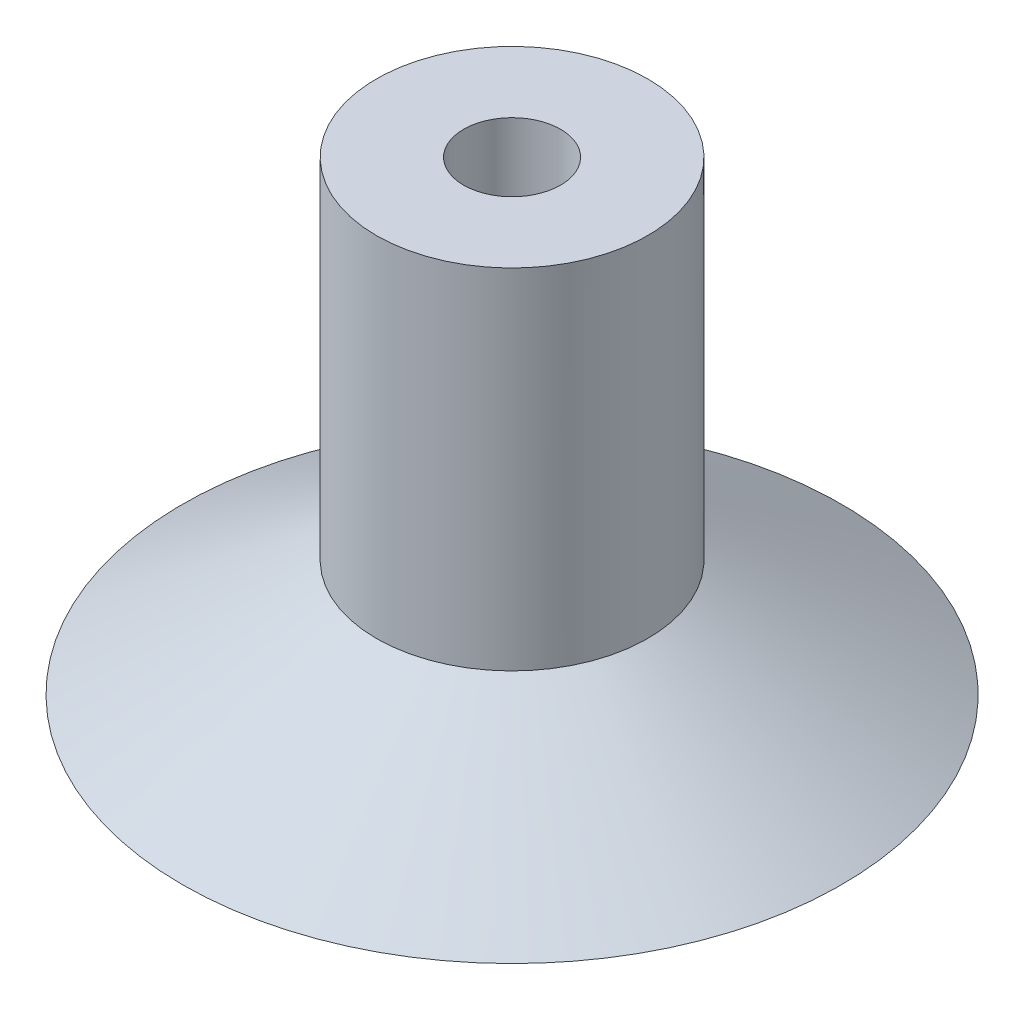
ISO-10303-21;
HEADER;
FILE_DESCRIPTION(('STEP AP214'),'2;1');
FILE_NAME('part.step','',(''),(''),'','','');
FILE_SCHEMA(('AUTOMOTIVE_DESIGN { 1 0 10303 214 1 1 1 1 }'));
ENDSEC;
DATA;
#1=APPLICATION_CONTEXT('core data for automotive mechanical design processes');
#2=APPLICATION_PROTOCOL_DEFINITION('international standard','automotive_design',2000,#1);
#3=PRODUCT_CONTEXT('',#1,'mechanical');
#4=PRODUCT('Part','Part','',(#3));
#5=PRODUCT_RELATED_PRODUCT_CATEGORY('part','',(#4));
#6=PRODUCT_DEFINITION_FORMATION('','',#4);
#7=PRODUCT_DEFINITION_CONTEXT('part definition',#1,'design');
#8=PRODUCT_DEFINITION('design','',#6,#7);
#9=PRODUCT_DEFINITION_SHAPE('','',#8);
#10=(LENGTH_UNIT() NAMED_UNIT(*) SI_UNIT(.MILLI.,.METRE.));
#11=(NAMED_UNIT(*) PLANE_ANGLE_UNIT() SI_UNIT($,.RADIAN.));
#12=(NAMED_UNIT(*) SI_UNIT($,.STERADIAN.) SOLID_ANGLE_UNIT());
#13=UNCERTAINTY_MEASURE_WITH_UNIT(LENGTH_MEASURE(1.E-05),#10,'distance_accuracy_value','');
#14=(GEOMETRIC_REPRESENTATION_CONTEXT(3) GLOBAL_UNCERTAINTY_ASSIGNED_CONTEXT((#13)) GLOBAL_UNIT_ASSIGNED_CONTEXT((#10,
#11,#12)) REPRESENTATION_CONTEXT('',''));
#15=CARTESIAN_POINT('',(0.,0.,0.));
#16=DIRECTION('',(0.,0.,1.));
#17=DIRECTION('',(1.,0.,0.));
#18=AXIS2_PLACEMENT_3D('',#15,#16,#17);
#19=CARTESIAN_POINT('',(-8.73225362560405,0.,8.5));
#20=DIRECTION('',(0.,-1.,0.));
#21=DIRECTION('',(0.,0.,-1.));
#22=AXIS2_PLACEMENT_3D('',#19,#20,#21);
#23=PLANE('',#22);
#24=CARTESIAN_POINT('',(0.,0.,0.));
#25=DIRECTION('',(0.,-1.,0.));
#26=DIRECTION('',(-1.16842128129653E-09,0.,1.));
#27=AXIS2_PLACEMENT_3D('',#24,#25,#26);
#28=CIRCLE('',#27,8.5);
#29=CARTESIAN_POINT('',(-9.93158089102053E-09,0.,8.5));
#30=VERTEX_POINT('',#29);
#31=EDGE_CURVE('E38',#30,#30,#28,.T.);
#32=ORIENTED_EDGE('',*,*,#31,.T.);
#33=EDGE_LOOP('',(#32));
#34=FACE_BOUND('',#33,.T.);
#35=CARTESIAN_POINT('',(0.,0.,0.));
#36=DIRECTION('',(0.,1.,0.));
#37=DIRECTION('',(0.,0.,-1.));
#38=AXIS2_PLACEMENT_3D('',#35,#36,#37);
#39=CIRCLE('',#38,8.);
#40=CARTESIAN_POINT('',(0.,0.,8.));
#41=VERTEX_POINT('',#40);
#42=EDGE_CURVE('E35',#41,#41,#39,.F.);
#43=ORIENTED_EDGE('',*,*,#42,.F.);
#44=EDGE_LOOP('',(#43));
#45=FACE_BOUND('',#44,.T.);
#46=ADVANCED_FACE('F15',(#34,#45),#23,.T.);
#47=CARTESIAN_POINT('',(-3.4999999999999,12.,-3.4999999999999));
#48=DIRECTION('',(0.,1.,0.));
#49=DIRECTION('',(0.,0.,1.));
#50=AXIS2_PLACEMENT_3D('',#47,#48,#49);
#51=PLANE('',#50);
#52=CARTESIAN_POINT('',(0.,12.,0.));
#53=DIRECTION('',(0.,1.,0.));
#54=DIRECTION('',(0.,0.,-1.));
#55=AXIS2_PLACEMENT_3D('',#52,#53,#54);
#56=CIRCLE('',#55,3.4999999999999);
#57=CARTESIAN_POINT('',(0.,12.,-3.4999999999999));
#58=VERTEX_POINT('',#57);
#59=EDGE_CURVE('E30',#58,#58,#56,.F.);
#60=ORIENTED_EDGE('',*,*,#59,.F.);
#61=EDGE_LOOP('',(#60));
#62=FACE_BOUND('',#61,.T.);
#63=CARTESIAN_POINT('',(0.,12.,0.));
#64=DIRECTION('',(0.,-1.,0.));
#65=DIRECTION('',(0.,0.,1.));
#66=AXIS2_PLACEMENT_3D('',#63,#64,#65);
#67=CIRCLE('',#66,1.2500000000001);
#68=CARTESIAN_POINT('',(0.,12.,1.2500000000001));
#69=VERTEX_POINT('',#68);
#70=EDGE_CURVE('E26',#69,#69,#67,.T.);
#71=ORIENTED_EDGE('',*,*,#70,.T.);
#72=EDGE_LOOP('',(#71));
#73=FACE_BOUND('',#72,.T.);
#74=ADVANCED_FACE('F57',(#62,#73),#51,.T.);
#75=CARTESIAN_POINT('',(0.,0.,0.));
#76=DIRECTION('',(0.,-1.,0.));
#77=DIRECTION('',(0.,0.,1.));
#78=AXIS2_PLACEMENT_3D('',#75,#76,#77);
#79=CYLINDRICAL_SURFACE('',#78,1.2500000000001);
#80=CARTESIAN_POINT('',(0.,1.,0.));
#81=DIRECTION('',(0.,-1.,0.));
#82=DIRECTION('',(0.,0.,1.));
#83=AXIS2_PLACEMENT_3D('',#80,#81,#82);
#84=CIRCLE('',#83,1.2500000000001);
#85=CARTESIAN_POINT('',(0.,1.,1.2500000000001));
#86=VERTEX_POINT('',#85);
#87=EDGE_CURVE('E22',#86,#86,#84,.T.);
#88=ORIENTED_EDGE('',*,*,#87,.T.);
#89=EDGE_LOOP('',(#88));
#90=FACE_BOUND('',#89,.T.);
#91=ORIENTED_EDGE('',*,*,#70,.F.);
#92=EDGE_LOOP('',(#91));
#93=FACE_BOUND('',#92,.T.);
#94=ADVANCED_FACE('F53',(#90,#93),#79,.F.);
#95=CARTESIAN_POINT('',(0.,0.,0.));
#96=DIRECTION('',(0.,-1.,0.));
#97=DIRECTION('',(0.,0.,1.));
#98=AXIS2_PLACEMENT_3D('',#95,#96,#97);
#99=CONICAL_SURFACE('',#98,8.,1.42371797140649);
#100=CARTESIAN_POINT('',(0.,0.,8.));
#101=CARTESIAN_POINT('',(0.,0.0104166666666665,7.9296875));
#102=CARTESIAN_POINT('',(0.,0.0208333333333332,7.85937500000001));
#103=CARTESIAN_POINT('',(0.,0.0416666666666665,7.71875000000001));
#104=CARTESIAN_POINT('',(0.,0.0520833333333332,7.64843750000001));
#105=CARTESIAN_POINT('',(0.,0.0729166666666666,7.50781250000001));
#106=CARTESIAN_POINT('',(0.,0.0833333333333332,7.43750000000001));
#107=CARTESIAN_POINT('',(0.,0.104166666666667,7.29687500000001));
#108=CARTESIAN_POINT('',(0.,0.114583333333333,7.22656250000001));
#109=CARTESIAN_POINT('',(0.,0.135416666666667,7.08593750000002));
#110=CARTESIAN_POINT('',(0.,0.145833333333333,7.01562500000002));
#111=CARTESIAN_POINT('',(0.,0.166666666666667,6.87500000000002));
#112=CARTESIAN_POINT('',(0.,0.177083333333333,6.80468750000002));
#113=CARTESIAN_POINT('',(0.,0.197916666666667,6.66406250000002));
#114=CARTESIAN_POINT('',(0.,0.208333333333333,6.59375000000002));
#115=CARTESIAN_POINT('',(0.,0.229166666666667,6.45312500000002));
#116=CARTESIAN_POINT('',(0.,0.239583333333333,6.38281250000003));
#117=CARTESIAN_POINT('',(0.,0.260416666666667,6.24218750000003));
#118=CARTESIAN_POINT('',(0.,0.270833333333333,6.17187500000003));
#119=CARTESIAN_POINT('',(0.,0.291666666666667,6.03125000000003));
#120=CARTESIAN_POINT('',(0.,0.302083333333333,5.96093750000003));
#121=CARTESIAN_POINT('',(0.,0.322916666666667,5.82031250000003));
#122=CARTESIAN_POINT('',(0.,0.333333333333333,5.75000000000004));
#123=CARTESIAN_POINT('',(0.,0.354166666666667,5.60937500000004));
#124=CARTESIAN_POINT('',(0.,0.364583333333333,5.53906250000004));
#125=CARTESIAN_POINT('',(0.,0.385416666666667,5.39843750000004));
#126=CARTESIAN_POINT('',(0.,0.395833333333333,5.32812500000004));
#127=CARTESIAN_POINT('',(0.,0.416666666666667,5.18750000000004));
#128=CARTESIAN_POINT('',(0.,0.427083333333333,5.11718750000004));
#129=CARTESIAN_POINT('',(0.,0.447916666666667,4.97656250000005));
#130=CARTESIAN_POINT('',(0.,0.458333333333333,4.90625000000005));
#131=CARTESIAN_POINT('',(0.,0.479166666666666,4.76562500000005));
#132=CARTESIAN_POINT('',(0.,0.489583333333333,4.69531250000005));
#133=CARTESIAN_POINT('',(0.,0.510416666666667,4.55468750000005));
#134=CARTESIAN_POINT('',(0.,0.520833333333333,4.48437500000005));
#135=CARTESIAN_POINT('',(0.,0.541666666666667,4.34375000000006));
#136=CARTESIAN_POINT('',(0.,0.552083333333333,4.27343750000006));
#137=CARTESIAN_POINT('',(0.,0.572916666666667,4.13281250000006));
#138=CARTESIAN_POINT('',(0.,0.583333333333333,4.06250000000006));
#139=CARTESIAN_POINT('',(0.,0.604166666666667,3.92187500000006));
#140=CARTESIAN_POINT('',(0.,0.614583333333333,3.85156250000006));
#141=CARTESIAN_POINT('',(0.,0.635416666666667,3.71093750000007));
#142=CARTESIAN_POINT('',(0.,0.645833333333333,3.64062500000007));
#143=CARTESIAN_POINT('',(0.,0.666666666666667,3.50000000000007));
#144=CARTESIAN_POINT('',(0.,0.677083333333333,3.42968750000007));
#145=CARTESIAN_POINT('',(0.,0.697916666666667,3.28906250000007));
#146=CARTESIAN_POINT('',(0.,0.708333333333333,3.21875000000007));
#147=CARTESIAN_POINT('',(0.,0.729166666666667,3.07812500000007));
#148=CARTESIAN_POINT('',(0.,0.739583333333333,3.00781250000008));
#149=CARTESIAN_POINT('',(0.,0.760416666666667,2.86718750000008));
#150=CARTESIAN_POINT('',(0.,0.770833333333333,2.79687500000008));
#151=CARTESIAN_POINT('',(0.,0.791666666666667,2.65625000000008));
#152=CARTESIAN_POINT('',(0.,0.802083333333333,2.58593750000008));
#153=CARTESIAN_POINT('',(0.,0.822916666666667,2.44531250000008));
#154=CARTESIAN_POINT('',(0.,0.833333333333333,2.37500000000008));
#155=CARTESIAN_POINT('',(0.,0.854166666666667,2.23437500000009));
#156=CARTESIAN_POINT('',(0.,0.864583333333333,2.16406250000009));
#157=CARTESIAN_POINT('',(0.,0.885416666666667,2.02343750000009));
#158=CARTESIAN_POINT('',(0.,0.895833333333333,1.95312500000009));
#159=CARTESIAN_POINT('',(0.,0.916666666666667,1.81250000000009));
#160=CARTESIAN_POINT('',(0.,0.927083333333333,1.74218750000009));
#161=CARTESIAN_POINT('',(0.,0.947916666666667,1.6015625000001));
#162=CARTESIAN_POINT('',(0.,0.958333333333333,1.5312500000001));
#163=CARTESIAN_POINT('',(0.,0.979166666666667,1.3906250000001));
#164=CARTESIAN_POINT('',(0.,0.989583333333333,1.3203125000001));
#165=CARTESIAN_POINT('',(0.,1.,1.2500000000001));
#166=B_SPLINE_CURVE_WITH_KNOTS('',3,(#100,#101,#102,#103,#104,#105,#106,#107,#108,#109,#110,
#111,#112,#113,#114,#115,#116,#117,#118,#119,#120,#121,#122,#123,#124,#125,#126,#127,#128,#129,
#130,#131,#132,#133,#134,#135,#136,#137,#138,#139,#140,#141,#142,#143,#144,#145,#146,#147,#148,
#149,#150,#151,#152,#153,#154,#155,#156,#157,#158,#159,#160,#161,#162,#163,#164,#165),
.UNSPECIFIED.,.F.,.F.,(4,2,2,2,2,2,2,2,2,2,2,2,2,2,2,2,2,2,2,2,2,2,2,2,2,2,2,2,2,2,2,2,4),(0.,
0.213239750999313,0.426479501998625,0.639719252997937,0.85295900399725,1.06619875499656,
1.27943850599587,1.49267825699519,1.7059180079945,1.91915775899381,2.13239750999312,
2.34563726099244,2.55887701199175,2.77211676299106,2.98535651399037,3.19859626498969,
3.411836015989,3.62507576698831,3.83831551798762,4.05155526898694,4.26479501998625,
4.47803477098556,4.69127452198487,4.90451427298418,5.1177540239835,5.33099377498281,
5.54423352598212,5.75747327698143,5.97071302798074,6.18395277898006,6.39719252997937,
6.61043228097868,6.82367203197799),.UNSPECIFIED.);
#167=EDGE_CURVE('BSEAM46',#41,#86,#166,.T.);
#168=ORIENTED_EDGE('',*,*,#42,.T.);
#169=ORIENTED_EDGE('',*,*,#87,.F.);
#170=ORIENTED_EDGE('',*,*,#167,.T.);
#171=ORIENTED_EDGE('',*,*,#167,.F.);
#172=EDGE_LOOP('',(#168,#170,#169,#171));
#173=FACE_BOUND('',#172,.T.);
#174=ADVANCED_FACE('F46',(#173),#99,.F.);
#175=CARTESIAN_POINT('',(0.,0.,0.));
#176=DIRECTION('',(0.,-1.,0.));
#177=DIRECTION('',(0.,0.,1.));
#178=AXIS2_PLACEMENT_3D('',#175,#176,#177);
#179=CONICAL_SURFACE('',#178,8.5,1.03037682652432);
#180=CARTESIAN_POINT('',(0.,3.,0.));
#181=DIRECTION('',(0.,-1.,0.));
#182=DIRECTION('',(0.,0.,1.));
#183=AXIS2_PLACEMENT_3D('',#180,#181,#182);
#184=CIRCLE('',#183,3.4999999999999);
#185=CARTESIAN_POINT('',(0.,3.,3.4999999999999));
#186=VERTEX_POINT('',#185);
#187=EDGE_CURVE('E10',#186,#186,#184,.T.);
#188=ORIENTED_EDGE('',*,*,#187,.T.);
#189=EDGE_LOOP('',(#188));
#190=FACE_BOUND('',#189,.T.);
#191=ORIENTED_EDGE('',*,*,#31,.F.);
#192=EDGE_LOOP('',(#191));
#193=FACE_BOUND('',#192,.T.);
#194=ADVANCED_FACE('F44',(#190,#193),#179,.T.);
#195=CARTESIAN_POINT('',(0.,0.,0.));
#196=DIRECTION('',(0.,-1.,0.));
#197=DIRECTION('',(0.,0.,1.));
#198=AXIS2_PLACEMENT_3D('',#195,#196,#197);
#199=CYLINDRICAL_SURFACE('',#198,3.4999999999999);
#200=ORIENTED_EDGE('',*,*,#59,.T.);
#201=EDGE_LOOP('',(#200));
#202=FACE_BOUND('',#201,.T.);
#203=ORIENTED_EDGE('',*,*,#187,.F.);
#204=EDGE_LOOP('',(#203));
#205=FACE_BOUND('',#204,.T.);
#206=ADVANCED_FACE('F17',(#202,#205),#199,.T.);
#207=CLOSED_SHELL('',(#46,#74,#94,#174,#194,#206));
#208=MANIFOLD_SOLID_BREP('B1',#207);
#209=ADVANCED_BREP_SHAPE_REPRESENTATION('',(#18,#208),#14);
#210=SHAPE_DEFINITION_REPRESENTATION(#9,#209);
ENDSEC;
END-ISO-10303-21;
